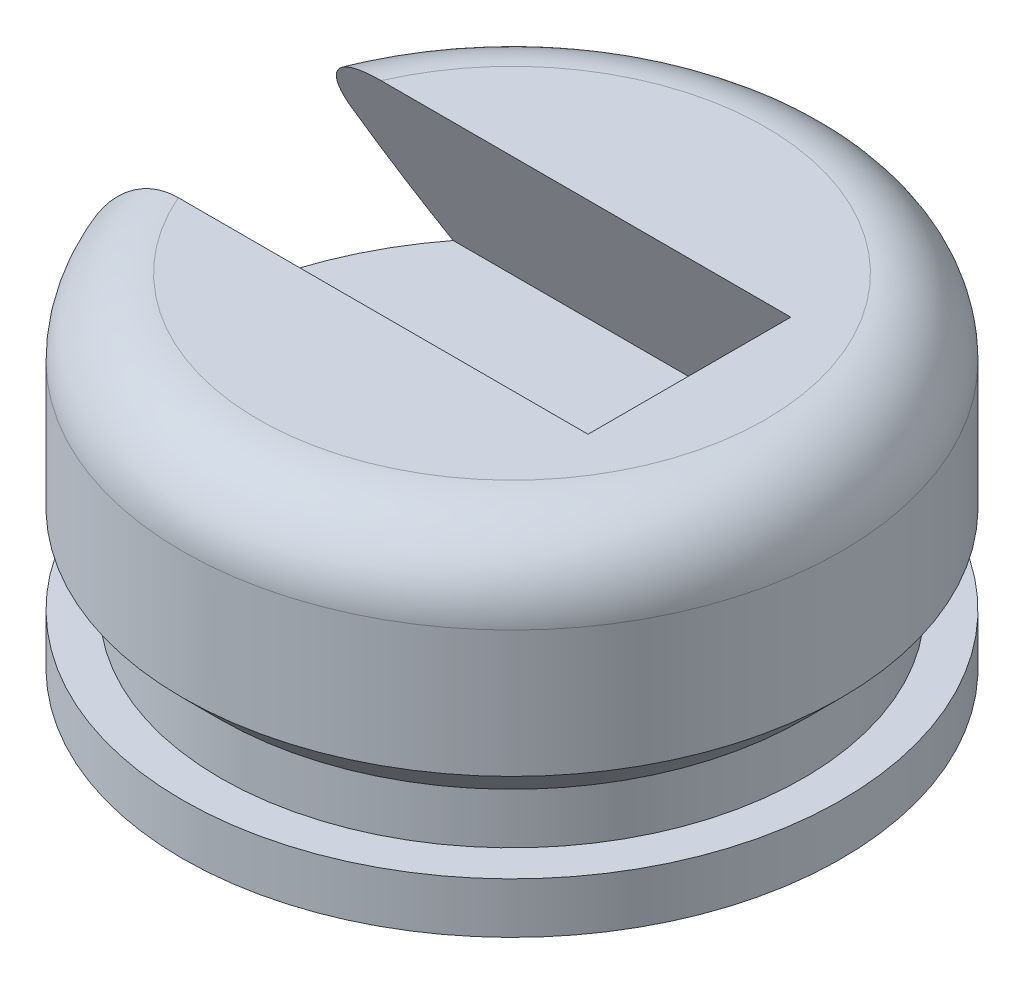
ISO-10303-21;
HEADER;
FILE_DESCRIPTION(('STEP AP214'),'2;1');
FILE_NAME('part.step','',(''),(''),'','','');
FILE_SCHEMA(('AUTOMOTIVE_DESIGN { 1 0 10303 214 1 1 1 1 }'));
ENDSEC;
DATA;
#1=APPLICATION_CONTEXT('core data for automotive mechanical design processes');
#2=APPLICATION_PROTOCOL_DEFINITION('international standard','automotive_design',2000,#1);
#3=PRODUCT_CONTEXT('',#1,'mechanical');
#4=PRODUCT('Part','Part','',(#3));
#5=PRODUCT_RELATED_PRODUCT_CATEGORY('part','',(#4));
#6=PRODUCT_DEFINITION_FORMATION('','',#4);
#7=PRODUCT_DEFINITION_CONTEXT('part definition',#1,'design');
#8=PRODUCT_DEFINITION('design','',#6,#7);
#9=PRODUCT_DEFINITION_SHAPE('','',#8);
#10=(LENGTH_UNIT() NAMED_UNIT(*) SI_UNIT(.MILLI.,.METRE.));
#11=(NAMED_UNIT(*) PLANE_ANGLE_UNIT() SI_UNIT($,.RADIAN.));
#12=(NAMED_UNIT(*) SI_UNIT($,.STERADIAN.) SOLID_ANGLE_UNIT());
#13=UNCERTAINTY_MEASURE_WITH_UNIT(LENGTH_MEASURE(1.E-05),#10,'distance_accuracy_value','');
#14=(GEOMETRIC_REPRESENTATION_CONTEXT(3) GLOBAL_UNCERTAINTY_ASSIGNED_CONTEXT((#13)) GLOBAL_UNIT_ASSIGNED_CONTEXT((#10,
#11,#12)) REPRESENTATION_CONTEXT('',''));
#15=CARTESIAN_POINT('',(0.,0.,0.));
#16=DIRECTION('',(0.,0.,1.));
#17=DIRECTION('',(1.,0.,0.));
#18=AXIS2_PLACEMENT_3D('',#15,#16,#17);
#19=CARTESIAN_POINT('',(0.,13.5,0.));
#20=DIRECTION('',(0.,-1.,0.));
#21=DIRECTION('',(0.,0.,-1.));
#22=AXIS2_PLACEMENT_3D('',#19,#20,#21);
#23=CYLINDRICAL_SURFACE('',#22,13.);
#24=CARTESIAN_POINT('',(0.,21.582669043407,0.));
#25=DIRECTION('',(0.,-0.443543109067423,0.896253039268936));
#26=DIRECTION('',(0.,-0.896253039268936,-0.443543109067423));
#27=AXIS2_PLACEMENT_3D('',#24,#25,#26);
#28=ELLIPSE('',#27,29.3094396784414,13.);
#29=CARTESIAN_POINT('',(-11.7863703324731,10.5,-5.48465809196881));
#30=VERTEX_POINT('',#29);
#31=CARTESIAN_POINT('',(-10.2787603486179,5.5,-7.95908824525017));
#32=VERTEX_POINT('',#31);
#33=EDGE_CURVE('E118',#30,#32,#28,.T.);
#34=ORIENTED_EDGE('',*,*,#33,.F.);
#35=CARTESIAN_POINT('',(0.,10.5,0.));
#36=DIRECTION('',(0.,1.,0.));
#37=DIRECTION('',(0.,0.,1.));
#38=AXIS2_PLACEMENT_3D('',#35,#36,#37);
#39=CIRCLE('',#38,13.);
#40=CARTESIAN_POINT('',(-11.7720433076639,10.5,5.51534190803119));
#41=VERTEX_POINT('',#40);
#42=EDGE_CURVE('E47',#30,#41,#39,.F.);
#43=ORIENTED_EDGE('',*,*,#42,.T.);
#44=CARTESIAN_POINT('',(0.,21.4190049033825,0.));
#45=DIRECTION('',(0.,-0.450861626242223,-0.892593857239796));
#46=DIRECTION('',(0.,-0.892593857239796,0.450861626242223));
#47=AXIS2_PLACEMENT_3D('',#44,#45,#46);
#48=ELLIPSE('',#47,28.8336803208349,13.);
#49=CARTESIAN_POINT('',(-10.2148782739848,5.5,8.04091175474983));
#50=VERTEX_POINT('',#49);
#51=EDGE_CURVE('E120',#50,#41,#48,.T.);
#52=ORIENTED_EDGE('',*,*,#51,.F.);
#53=CARTESIAN_POINT('',(0.,5.50000000000003,0.));
#54=DIRECTION('',(0.,1.,0.));
#55=DIRECTION('',(0.,0.,1.));
#56=AXIS2_PLACEMENT_3D('',#53,#54,#55);
#57=CIRCLE('',#56,13.);
#58=EDGE_CURVE('E132',#50,#32,#57,.T.);
#59=ORIENTED_EDGE('',*,*,#58,.T.);
#60=EDGE_LOOP('',(#34,#43,#52,#59));
#61=FACE_BOUND('',#60,.T.);
#62=ADVANCED_FACE('F34',(#61),#23,.T.);
#63=CARTESIAN_POINT('',(0.,13.5,0.));
#64=DIRECTION('',(0.,1.,0.));
#65=DIRECTION('',(0.,0.,1.));
#66=AXIS2_PLACEMENT_3D('',#63,#64,#65);
#67=PLANE('',#66);
#68=DIRECTION('',(-1.,0.,0.));
#69=VECTOR('',#68,1.);
#70=CARTESIAN_POINT('',(7.,13.5,4.));
#71=LINE('',#70,#69);
#72=CARTESIAN_POINT('',(7.,13.5,4.));
#73=VERTEX_POINT('',#72);
#74=CARTESIAN_POINT('',(-9.16515138991168,13.5,4.));
#75=VERTEX_POINT('',#74);
#76=EDGE_CURVE('E90',#73,#75,#71,.T.);
#77=ORIENTED_EDGE('',*,*,#76,.T.);
#78=CARTESIAN_POINT('',(0.,13.5,0.));
#79=DIRECTION('',(0.,1.,0.));
#80=DIRECTION('',(0.,0.,1.));
#81=AXIS2_PLACEMENT_3D('',#78,#79,#80);
#82=CIRCLE('',#81,10.);
#83=CARTESIAN_POINT('',(-9.16515138991168,13.5,-4.));
#84=VERTEX_POINT('',#83);
#85=EDGE_CURVE('E138',#75,#84,#82,.T.);
#86=ORIENTED_EDGE('',*,*,#85,.T.);
#87=DIRECTION('',(-1.,0.,0.));
#88=VECTOR('',#87,1.);
#89=CARTESIAN_POINT('',(7.,13.5,-4.));
#90=LINE('',#89,#88);
#91=CARTESIAN_POINT('',(7.,13.5,-4.));
#92=VERTEX_POINT('',#91);
#93=EDGE_CURVE('E111',#92,#84,#90,.T.);
#94=ORIENTED_EDGE('',*,*,#93,.F.);
#95=DIRECTION('',(0.,0.,1.));
#96=VECTOR('',#95,1.);
#97=CARTESIAN_POINT('',(7.,13.5,-4.));
#98=LINE('',#97,#96);
#99=EDGE_CURVE('E96',#92,#73,#98,.T.);
#100=ORIENTED_EDGE('',*,*,#99,.T.);
#101=EDGE_LOOP('',(#77,#86,#94,#100));
#102=FACE_BOUND('',#101,.T.);
#103=ADVANCED_FACE('F155',(#102),#67,.T.);
#104=CARTESIAN_POINT('',(0.,2.,0.));
#105=DIRECTION('',(0.,1.,0.));
#106=DIRECTION('',(0.,0.,1.));
#107=AXIS2_PLACEMENT_3D('',#104,#105,#106);
#108=PLANE('',#107);
#109=CARTESIAN_POINT('',(0.,2.,0.));
#110=DIRECTION('',(0.,1.,0.));
#111=DIRECTION('',(0.,0.,1.));
#112=AXIS2_PLACEMENT_3D('',#109,#110,#111);
#113=CIRCLE('',#112,13.);
#114=CARTESIAN_POINT('',(0.,2.,13.));
#115=VERTEX_POINT('',#114);
#116=EDGE_CURVE('E126',#115,#115,#113,.T.);
#117=ORIENTED_EDGE('',*,*,#116,.T.);
#118=EDGE_LOOP('',(#117));
#119=FACE_BOUND('',#118,.T.);
#120=CARTESIAN_POINT('',(0.,2.,0.));
#121=DIRECTION('',(0.,1.,0.));
#122=DIRECTION('',(0.,0.,1.));
#123=AXIS2_PLACEMENT_3D('',#120,#121,#122);
#124=CIRCLE('',#123,11.5);
#125=CARTESIAN_POINT('',(0.,2.,11.5));
#126=VERTEX_POINT('',#125);
#127=EDGE_CURVE('E122',#126,#126,#124,.T.);
#128=ORIENTED_EDGE('',*,*,#127,.F.);
#129=EDGE_LOOP('',(#128));
#130=FACE_BOUND('',#129,.T.);
#131=ADVANCED_FACE('F158',(#119,#130),#108,.T.);
#132=CARTESIAN_POINT('',(0.,2.,0.));
#133=DIRECTION('',(0.,-1.,0.));
#134=DIRECTION('',(0.,0.,-1.));
#135=AXIS2_PLACEMENT_3D('',#132,#133,#134);
#136=CYLINDRICAL_SURFACE('',#135,13.);
#137=ORIENTED_EDGE('',*,*,#116,.F.);
#138=EDGE_LOOP('',(#137));
#139=FACE_BOUND('',#138,.T.);
#140=CARTESIAN_POINT('',(0.,0.,0.));
#141=DIRECTION('',(0.,1.,0.));
#142=DIRECTION('',(0.,0.,1.));
#143=AXIS2_PLACEMENT_3D('',#140,#141,#142);
#144=CIRCLE('',#143,13.);
#145=CARTESIAN_POINT('',(0.,0.,13.));
#146=VERTEX_POINT('',#145);
#147=EDGE_CURVE('E125',#146,#146,#144,.T.);
#148=ORIENTED_EDGE('',*,*,#147,.T.);
#149=EDGE_LOOP('',(#148));
#150=FACE_BOUND('',#149,.T.);
#151=ADVANCED_FACE('F168',(#139,#150),#136,.T.);
#152=CARTESIAN_POINT('',(0.,0.,0.));
#153=DIRECTION('',(0.,1.,0.));
#154=DIRECTION('',(0.,0.,1.));
#155=AXIS2_PLACEMENT_3D('',#152,#153,#154);
#156=PLANE('',#155);
#157=ORIENTED_EDGE('',*,*,#147,.F.);
#158=EDGE_LOOP('',(#157));
#159=FACE_BOUND('',#158,.T.);
#160=ADVANCED_FACE('F164',(#159),#156,.F.);
#161=CARTESIAN_POINT('',(0.,3.5,0.));
#162=DIRECTION('',(0.,-1.,0.));
#163=DIRECTION('',(0.,0.,-1.));
#164=AXIS2_PLACEMENT_3D('',#161,#162,#163);
#165=CYLINDRICAL_SURFACE('',#164,11.5);
#166=CARTESIAN_POINT('',(0.,4.00000000000002,0.));
#167=DIRECTION('',(0.,1.,0.));
#168=DIRECTION('',(0.,0.,1.));
#169=AXIS2_PLACEMENT_3D('',#166,#167,#168);
#170=CIRCLE('',#169,11.5);
#171=CARTESIAN_POINT('',(0.,4.00000000000002,11.5));
#172=VERTEX_POINT('',#171);
#173=EDGE_CURVE('E135',#172,#172,#170,.F.);
#174=ORIENTED_EDGE('',*,*,#173,.T.);
#175=EDGE_LOOP('',(#174));
#176=FACE_BOUND('',#175,.T.);
#177=ORIENTED_EDGE('',*,*,#127,.T.);
#178=EDGE_LOOP('',(#177));
#179=FACE_BOUND('',#178,.T.);
#180=ADVANCED_FACE('F151',(#176,#179),#165,.T.);
#181=CARTESIAN_POINT('',(7.,5.5,0.040911754749828));
#182=DIRECTION('',(0.,1.,0.));
#183=DIRECTION('',(0.,0.,1.));
#184=AXIS2_PLACEMENT_3D('',#181,#182,#183);
#185=PLANE('',#184);
#186=DIRECTION('',(-1.,0.,0.));
#187=VECTOR('',#186,1.);
#188=CARTESIAN_POINT('',(7.,5.5,-7.95908824525017));
#189=LINE('',#188,#187);
#190=CARTESIAN_POINT('',(7.,5.5,-7.95908824525017));
#191=VERTEX_POINT('',#190);
#192=EDGE_CURVE('E105',#191,#32,#189,.T.);
#193=ORIENTED_EDGE('',*,*,#192,.T.);
#194=CARTESIAN_POINT('',(0.,5.5,0.));
#195=DIRECTION('',(0.,1.,0.));
#196=DIRECTION('',(0.,0.,1.));
#197=AXIS2_PLACEMENT_3D('',#194,#195,#196);
#198=CIRCLE('',#197,13.);
#199=EDGE_CURVE('E104',#32,#50,#198,.T.);
#200=ORIENTED_EDGE('',*,*,#199,.T.);
#201=DIRECTION('',(-1.,0.,0.));
#202=VECTOR('',#201,1.);
#203=CARTESIAN_POINT('',(7.,5.5,8.04091175474983));
#204=LINE('',#203,#202);
#205=CARTESIAN_POINT('',(7.,5.5,8.04091175474983));
#206=VERTEX_POINT('',#205);
#207=EDGE_CURVE('E88',#206,#50,#204,.T.);
#208=ORIENTED_EDGE('',*,*,#207,.F.);
#209=DIRECTION('',(0.,0.,-1.));
#210=VECTOR('',#209,1.);
#211=CARTESIAN_POINT('',(7.,5.5,0.040911754749828));
#212=LINE('',#211,#210);
#213=EDGE_CURVE('E95',#206,#191,#212,.T.);
#214=ORIENTED_EDGE('',*,*,#213,.T.);
#215=EDGE_LOOP('',(#193,#200,#208,#214));
#216=FACE_BOUND('',#215,.T.);
#217=ADVANCED_FACE('F101',(#216),#185,.T.);
#218=CARTESIAN_POINT('',(7.,5.5,8.04091175474983));
#219=DIRECTION('',(0.,-0.450861626242223,-0.892593857239796));
#220=DIRECTION('',(0.,0.892593857239796,-0.450861626242223));
#221=AXIS2_PLACEMENT_3D('',#218,#219,#220);
#222=PLANE('',#221);
#223=ORIENTED_EDGE('',*,*,#51,.T.);
#224=CARTESIAN_POINT('',(-11.7720433076639,10.5,5.51534190803119));
#225=CARTESIAN_POINT('',(-11.7897170336309,10.5746965566882,5.47761163378612));
#226=CARTESIAN_POINT('',(-11.8042286173409,10.6499671218383,5.43959141984838));
#227=CARTESIAN_POINT('',(-11.8266320632922,10.801333334804,5.36313423119274));
#228=CARTESIAN_POINT('',(-11.8345198485188,10.8774294616201,5.324697014525));
#229=CARTESIAN_POINT('',(-11.8478149266317,11.1069913081221,5.20874211902851));
#230=CARTESIAN_POINT('',(-11.8426955733273,11.2610781492205,5.13091070309764));
#231=CARTESIAN_POINT('',(-11.802420829318,11.5667339648182,4.97651968082808));
#232=CARTESIAN_POINT('',(-11.7671497560879,11.7182909467991,4.89996613207799));
#233=CARTESIAN_POINT('',(-11.6656077530552,12.0126482932509,4.75128212440622));
#234=CARTESIAN_POINT('',(-11.5994135411625,12.1554693447418,4.67914121618179));
#235=CARTESIAN_POINT('',(-11.4444226891023,12.414047144415,4.54852995740469));
#236=CARTESIAN_POINT('',(-11.3583106887383,12.5310857460355,4.48941212477374));
#237=CARTESIAN_POINT('',(-11.1632810084945,12.7489624543606,4.37935955580408));
#238=CARTESIAN_POINT('',(-11.0543669147245,12.8498031041327,4.32842353492648));
#239=CARTESIAN_POINT('',(-10.8277289605952,13.0235281455484,4.24067258968261));
#240=CARTESIAN_POINT('',(-10.7116062512505,13.0980853230429,4.20301271781528));
#241=CARTESIAN_POINT('',(-10.4669470337779,13.2286245028622,4.13707555454188));
#242=CARTESIAN_POINT('',(-10.3384111465239,13.2846074336004,4.10879779418123));
#243=CARTESIAN_POINT('',(-10.0732159667664,13.377066846938,4.06209525290707));
#244=CARTESIAN_POINT('',(-9.93657406293968,13.4135835180269,4.04365017222616));
#245=CARTESIAN_POINT('',(-9.65875169326359,13.4675836171307,4.01637396782289));
#246=CARTESIAN_POINT('',(-9.51757426768142,13.4850795320131,4.00753653680933));
#247=CARTESIAN_POINT('',(-9.34079294814846,13.4958006844716,4.00212113293507));
#248=CARTESIAN_POINT('',(-9.30565347219834,13.4973830913893,4.00132183709578));
#249=CARTESIAN_POINT('',(-9.23539631450444,13.4994811691217,4.00026206872436));
#250=CARTESIAN_POINT('',(-9.20027870330852,13.4999987130903,4.00000065003608));
#251=CARTESIAN_POINT('',(-9.16515138991168,13.5,4.));
#252=B_SPLINE_CURVE_WITH_KNOTS('',3,(#224,#225,#226,#227,#228,#229,#230,#231,#232,#233,#234,
#235,#236,#237,#238,#239,#240,#241,#242,#243,#244,#245,#246,#247,#248,#249,#250,#251),
.UNSPECIFIED.,.F.,.F.,(4,2,2,2,2,2,2,2,2,2,2,2,2,4),(0.,0.25647263673171,0.513103019490802,
1.02858173318906,1.54604709628984,2.06223543078559,2.53026900674692,2.99822902978208,
3.42530264383125,3.85235490785598,4.2785220653701,4.70440928068915,4.80995227549446,
4.91530945496125),.UNSPECIFIED.);
#253=EDGE_CURVE('E11',#41,#75,#252,.T.);
#254=ORIENTED_EDGE('',*,*,#253,.T.);
#255=ORIENTED_EDGE('',*,*,#76,.F.);
#256=DIRECTION('',(0.,-0.892593857239797,0.450861626242223));
#257=VECTOR('',#256,1.);
#258=CARTESIAN_POINT('',(7.,5.5,8.04091175474983));
#259=LINE('',#258,#257);
#260=EDGE_CURVE('E85',#73,#206,#259,.T.);
#261=ORIENTED_EDGE('',*,*,#260,.T.);
#262=ORIENTED_EDGE('',*,*,#207,.T.);
#263=EDGE_LOOP('',(#223,#254,#255,#261,#262));
#264=FACE_BOUND('',#263,.T.);
#265=ADVANCED_FACE('F87',(#264),#222,.T.);
#266=CARTESIAN_POINT('',(7.,5.5,-7.95908824525017));
#267=DIRECTION('',(0.,-0.443543109067423,0.896253039268936));
#268=DIRECTION('',(0.,-0.896253039268936,-0.443543109067423));
#269=AXIS2_PLACEMENT_3D('',#266,#267,#268);
#270=PLANE('',#269);
#271=ORIENTED_EDGE('',*,*,#93,.T.);
#272=CARTESIAN_POINT('',(-9.16515138991168,13.5,-4.));
#273=CARTESIAN_POINT('',(-9.24283311367229,13.5000076952318,-3.9999961917373));
#274=CARTESIAN_POINT('',(-9.32053581120389,13.4974651685961,-4.00125445265186));
#275=CARTESIAN_POINT('',(-9.47554939697391,13.4870528643305,-4.00640735657983));
#276=CARTESIAN_POINT('',(-9.55285995513424,13.4791791712683,-4.01030393728602));
#277=CARTESIAN_POINT('',(-9.70682386389228,13.4578376858454,-4.02086554029526));
#278=CARTESIAN_POINT('',(-9.7834737288484,13.4443493229627,-4.02754074266232));
#279=CARTESIAN_POINT('',(-9.9352009514563,13.4116548410217,-4.04372078505448));
#280=CARTESIAN_POINT('',(-10.0102786754404,13.3924500702036,-4.05322495785429));
#281=CARTESIAN_POINT('',(-10.2329542363939,13.3259082943979,-4.08615555315561));
#282=CARTESIAN_POINT('',(-10.3774253662825,13.2697196535398,-4.11396252659783));
#283=CARTESIAN_POINT('',(-10.6520826440504,13.1346652204159,-4.18079907892904));
#284=CARTESIAN_POINT('',(-10.7822996465021,13.0558498029138,-4.2198037280512));
#285=CARTESIAN_POINT('',(-11.0147901492419,12.8846502771377,-4.30452798181276));
#286=CARTESIAN_POINT('',(-11.1184384203863,12.7937627279136,-4.34950696028436));
#287=CARTESIAN_POINT('',(-11.3068768432967,12.5973775641106,-4.44669523447862));
#288=CARTESIAN_POINT('',(-11.3916567485251,12.4918720614092,-4.49890843392292));
#289=CARTESIAN_POINT('',(-11.5390385839972,12.2716796404106,-4.60787858713151));
#290=CARTESIAN_POINT('',(-11.60200747358,12.157188940656,-4.66453843508011));
#291=CARTESIAN_POINT('',(-11.7070377893595,11.920791651561,-4.78152815113822));
#292=CARTESIAN_POINT('',(-11.7490980746244,11.7988846579388,-4.84185821932115));
#293=CARTESIAN_POINT('',(-11.8144198415801,11.5427669069016,-4.96860731651256));
#294=CARTESIAN_POINT('',(-11.8362796031166,11.4082717684638,-5.03516708171663));
#295=CARTESIAN_POINT('',(-11.85716384802,11.1378909569685,-5.16897476828313));
#296=CARTESIAN_POINT('',(-11.8561892641618,11.0020053409383,-5.2362226614236));
#297=CARTESIAN_POINT('',(-11.8391723019513,10.8052576127812,-5.33359036365191));
#298=CARTESIAN_POINT('',(-11.8315960366211,10.7437097393754,-5.36404954641707));
#299=CARTESIAN_POINT('',(-11.8121521455622,10.6213200835623,-5.4246184773758));
#300=CARTESIAN_POINT('',(-11.8002955279769,10.5604768993978,-5.45472891927944));
#301=CARTESIAN_POINT('',(-11.7863703324732,10.5,-5.48465809196882));
#302=B_SPLINE_CURVE_WITH_KNOTS('',3,(#272,#273,#274,#275,#276,#277,#278,#279,#280,#281,#282,
#283,#284,#285,#286,#287,#288,#289,#290,#291,#292,#293,#294,#295,#296,#297,#298,#299,#300,#301),
.UNSPECIFIED.,.F.,.F.,(4,2,2,2,2,2,2,2,2,2,2,2,2,2,4),(0.,0.233022774765429,0.466216877143774,
0.700272961346636,0.934273886060719,1.40397905964461,1.87264651613043,2.30551018281373,
2.73860834725799,3.16401876504725,3.58945239390147,4.04257590063398,4.49568089746273,
4.70283570467223,4.90946150598254),.UNSPECIFIED.);
#303=EDGE_CURVE('E61',#84,#30,#302,.T.);
#304=ORIENTED_EDGE('',*,*,#303,.T.);
#305=ORIENTED_EDGE('',*,*,#33,.T.);
#306=ORIENTED_EDGE('',*,*,#192,.F.);
#307=DIRECTION('',(0.,0.896253039268936,0.443543109067423));
#308=VECTOR('',#307,1.);
#309=CARTESIAN_POINT('',(7.,5.5,-7.95908824525017));
#310=LINE('',#309,#308);
#311=EDGE_CURVE('E109',#191,#92,#310,.T.);
#312=ORIENTED_EDGE('',*,*,#311,.T.);
#313=EDGE_LOOP('',(#271,#304,#305,#306,#312));
#314=FACE_BOUND('',#313,.T.);
#315=ADVANCED_FACE('F145',(#314),#270,.T.);
#316=CARTESIAN_POINT('',(7.,0.,0.));
#317=DIRECTION('',(-1.,0.,0.));
#318=DIRECTION('',(0.,0.,1.));
#319=AXIS2_PLACEMENT_3D('',#316,#317,#318);
#320=PLANE('',#319);
#321=ORIENTED_EDGE('',*,*,#99,.F.);
#322=ORIENTED_EDGE('',*,*,#311,.F.);
#323=ORIENTED_EDGE('',*,*,#213,.F.);
#324=ORIENTED_EDGE('',*,*,#260,.F.);
#325=EDGE_LOOP('',(#321,#322,#323,#324));
#326=FACE_BOUND('',#325,.T.);
#327=ADVANCED_FACE('F108',(#326),#320,.T.);
#328=CARTESIAN_POINT('',(0.,5.50000000000003,0.));
#329=DIRECTION('',(0.,1.,0.));
#330=DIRECTION('',(0.,0.,1.));
#331=AXIS2_PLACEMENT_3D('',#328,#329,#330);
#332=CONICAL_SURFACE('',#331,13.,0.785398163397443);
#333=ORIENTED_EDGE('',*,*,#173,.F.);
#334=EDGE_LOOP('',(#333));
#335=FACE_BOUND('',#334,.T.);
#336=ORIENTED_EDGE('',*,*,#58,.F.);
#337=ORIENTED_EDGE('',*,*,#199,.F.);
#338=EDGE_LOOP('',(#336,#337));
#339=FACE_BOUND('',#338,.T.);
#340=ADVANCED_FACE('F175',(#335,#339),#332,.T.);
#341=CARTESIAN_POINT('',(0.,10.5,0.));
#342=DIRECTION('',(0.,1.,0.));
#343=DIRECTION('',(0.,0.,1.));
#344=AXIS2_PLACEMENT_3D('',#341,#342,#343);
#345=TOROIDAL_SURFACE('',#344,10.,3.);
#346=ORIENTED_EDGE('',*,*,#253,.F.);
#347=ORIENTED_EDGE('',*,*,#42,.F.);
#348=ORIENTED_EDGE('',*,*,#303,.F.);
#349=ORIENTED_EDGE('',*,*,#85,.F.);
#350=EDGE_LOOP('',(#346,#347,#348,#349));
#351=FACE_BOUND('',#350,.T.);
#352=ADVANCED_FACE('F36',(#351),#345,.T.);
#353=CLOSED_SHELL('',(#62,#103,#131,#151,#160,#180,#217,#265,#315,#327,#340,#352));
#354=MANIFOLD_SOLID_BREP('B2',#353);
#355=ADVANCED_BREP_SHAPE_REPRESENTATION('',(#18,#354),#14);
#356=SHAPE_DEFINITION_REPRESENTATION(#9,#355);
ENDSEC;
END-ISO-10303-21;
